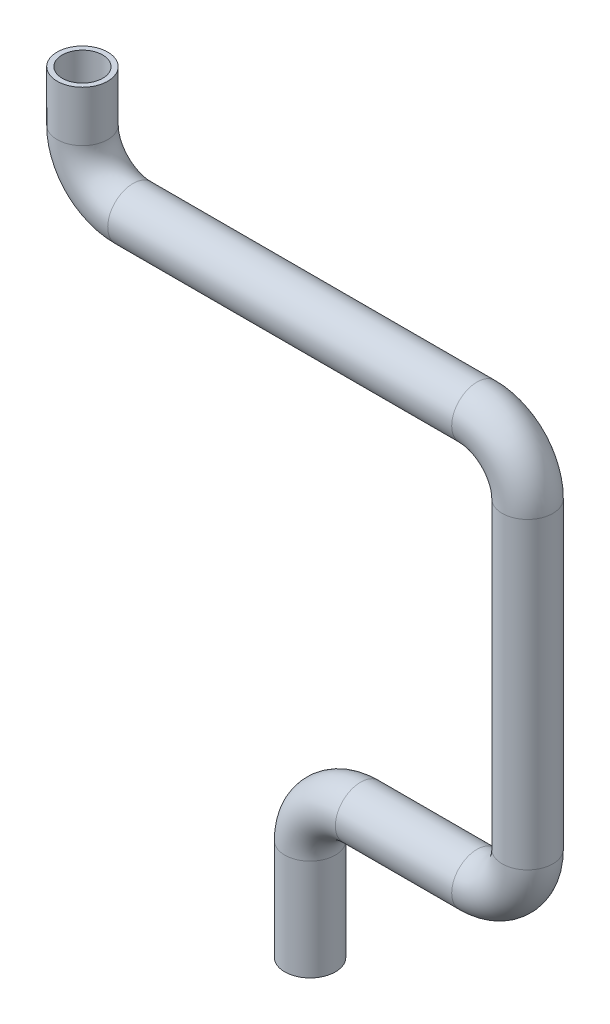
ISO-10303-21;
HEADER;
FILE_DESCRIPTION(('STEP AP214'),'2;1');
FILE_NAME('part.step','',(''),(''),'','','');
FILE_SCHEMA(('AUTOMOTIVE_DESIGN { 1 0 10303 214 1 1 1 1 }'));
ENDSEC;
DATA;
#1=APPLICATION_CONTEXT('core data for automotive mechanical design processes');
#2=APPLICATION_PROTOCOL_DEFINITION('international standard','automotive_design',2000,#1);
#3=PRODUCT_CONTEXT('',#1,'mechanical');
#4=PRODUCT('Part','Part','',(#3));
#5=PRODUCT_RELATED_PRODUCT_CATEGORY('part','',(#4));
#6=PRODUCT_DEFINITION_FORMATION('','',#4);
#7=PRODUCT_DEFINITION_CONTEXT('part definition',#1,'design');
#8=PRODUCT_DEFINITION('design','',#6,#7);
#9=PRODUCT_DEFINITION_SHAPE('','',#8);
#10=(LENGTH_UNIT() NAMED_UNIT(*) SI_UNIT(.MILLI.,.METRE.));
#11=(NAMED_UNIT(*) PLANE_ANGLE_UNIT() SI_UNIT($,.RADIAN.));
#12=(NAMED_UNIT(*) SI_UNIT($,.STERADIAN.) SOLID_ANGLE_UNIT());
#13=UNCERTAINTY_MEASURE_WITH_UNIT(LENGTH_MEASURE(1.E-05),#10,'distance_accuracy_value','');
#14=(GEOMETRIC_REPRESENTATION_CONTEXT(3) GLOBAL_UNCERTAINTY_ASSIGNED_CONTEXT((#13)) GLOBAL_UNIT_ASSIGNED_CONTEXT((#10,
#11,#12)) REPRESENTATION_CONTEXT('',''));
#15=CARTESIAN_POINT('',(0.,0.,0.));
#16=DIRECTION('',(0.,0.,1.));
#17=DIRECTION('',(1.,0.,0.));
#18=AXIS2_PLACEMENT_3D('',#15,#16,#17);
#19=CARTESIAN_POINT('',(0.,0.,0.));
#20=DIRECTION('',(0.,-1.,0.));
#21=DIRECTION('',(0.,0.,-1.));
#22=AXIS2_PLACEMENT_3D('',#19,#20,#21);
#23=PLANE('',#22);
#24=CARTESIAN_POINT('',(0.,0.,0.));
#25=DIRECTION('',(0.,-1.,0.));
#26=DIRECTION('',(0.,0.,-1.));
#27=AXIS2_PLACEMENT_3D('',#24,#25,#26);
#28=CIRCLE('',#27,4.);
#29=CARTESIAN_POINT('',(0.,0.,-4.));
#30=VERTEX_POINT('',#29);
#31=EDGE_CURVE('E103',#30,#30,#28,.T.);
#32=ORIENTED_EDGE('',*,*,#31,.F.);
#33=EDGE_LOOP('',(#32));
#34=FACE_BOUND('',#33,.T.);
#35=CARTESIAN_POINT('',(0.,0.,0.));
#36=DIRECTION('',(0.,-1.,0.));
#37=DIRECTION('',(0.,0.,-1.));
#38=AXIS2_PLACEMENT_3D('',#35,#36,#37);
#39=CIRCLE('',#38,5.);
#40=CARTESIAN_POINT('',(0.,0.,-5.));
#41=VERTEX_POINT('',#40);
#42=EDGE_CURVE('E100',#41,#41,#39,.T.);
#43=ORIENTED_EDGE('',*,*,#42,.T.);
#44=EDGE_LOOP('',(#43));
#45=FACE_BOUND('',#44,.T.);
#46=ADVANCED_FACE('F66',(#34,#45),#23,.T.);
#47=CARTESIAN_POINT('',(-45.,130.,0.));
#48=DIRECTION('',(0.,-1.,0.));
#49=DIRECTION('',(0.,0.,-1.));
#50=AXIS2_PLACEMENT_3D('',#47,#48,#49);
#51=PLANE('',#50);
#52=CARTESIAN_POINT('',(-44.9999999999999,130.,0.));
#53=DIRECTION('',(0.,-1.,0.));
#54=DIRECTION('',(0.,0.,-1.));
#55=AXIS2_PLACEMENT_3D('',#52,#53,#54);
#56=CIRCLE('',#55,4.);
#57=CARTESIAN_POINT('',(-44.9999999999999,130.,-4.));
#58=VERTEX_POINT('',#57);
#59=EDGE_CURVE('E106',#58,#58,#56,.T.);
#60=ORIENTED_EDGE('',*,*,#59,.T.);
#61=EDGE_LOOP('',(#60));
#62=FACE_BOUND('',#61,.T.);
#63=CARTESIAN_POINT('',(-45.,130.,0.));
#64=DIRECTION('',(0.,-1.,0.));
#65=DIRECTION('',(0.,0.,-1.));
#66=AXIS2_PLACEMENT_3D('',#63,#64,#65);
#67=CIRCLE('',#66,5.);
#68=CARTESIAN_POINT('',(-45.,130.,-5.));
#69=VERTEX_POINT('',#68);
#70=EDGE_CURVE('E11',#69,#69,#67,.T.);
#71=ORIENTED_EDGE('',*,*,#70,.F.);
#72=EDGE_LOOP('',(#71));
#73=FACE_BOUND('',#72,.T.);
#74=ADVANCED_FACE('F134',(#62,#73),#51,.F.);
#75=CARTESIAN_POINT('',(0.,0.,0.));
#76=DIRECTION('',(0.,1.,0.));
#77=DIRECTION('',(0.,0.,1.));
#78=AXIS2_PLACEMENT_3D('',#75,#76,#77);
#79=CYLINDRICAL_SURFACE('',#78,5.);
#80=CARTESIAN_POINT('',(0.,20.,0.));
#81=DIRECTION('',(0.,-1.,0.));
#82=DIRECTION('',(0.,0.,-1.));
#83=AXIS2_PLACEMENT_3D('',#80,#81,#82);
#84=CIRCLE('',#83,5.);
#85=CARTESIAN_POINT('',(-5.00000000000007,20.,0.));
#86=VERTEX_POINT('',#85);
#87=EDGE_CURVE('E97',#86,#86,#84,.T.);
#88=ORIENTED_EDGE('',*,*,#87,.T.);
#89=EDGE_LOOP('',(#88));
#90=FACE_BOUND('',#89,.T.);
#91=ORIENTED_EDGE('',*,*,#42,.F.);
#92=EDGE_LOOP('',(#91));
#93=FACE_BOUND('',#92,.T.);
#94=ADVANCED_FACE('F196',(#90,#93),#79,.T.);
#95=CARTESIAN_POINT('',(9.99999999999986,20.,0.));
#96=DIRECTION('',(0.,0.,-1.));
#97=DIRECTION('',(-1.,0.,0.));
#98=AXIS2_PLACEMENT_3D('',#95,#96,#97);
#99=TOROIDAL_SURFACE('',#98,9.99999999999993,5.);
#100=CARTESIAN_POINT('',(9.99999999999979,29.9999999999999,0.));
#101=DIRECTION('',(-1.,0.,0.));
#102=DIRECTION('',(0.,0.,-1.));
#103=AXIS2_PLACEMENT_3D('',#100,#101,#102);
#104=CIRCLE('',#103,5.);
#105=CARTESIAN_POINT('',(9.99999999999975,34.9999999999999,0.));
#106=VERTEX_POINT('',#105);
#107=EDGE_CURVE('E94',#106,#106,#104,.T.);
#108=CARTESIAN_POINT('',(9.99999999999986,20.,0.));
#109=DIRECTION('',(0.,0.,-1.));
#110=DIRECTION('',(-1.,0.,0.));
#111=AXIS2_PLACEMENT_3D('',#108,#109,#110);
#112=CIRCLE('',#111,14.9999999999999);
#113=EDGE_CURVE('',#86,#106,#112,.T.);
#114=ORIENTED_EDGE('',*,*,#87,.F.);
#115=ORIENTED_EDGE('',*,*,#107,.T.);
#116=ORIENTED_EDGE('',*,*,#113,.T.);
#117=ORIENTED_EDGE('',*,*,#113,.F.);
#118=EDGE_LOOP('',(#114,#116,#115,#117));
#119=FACE_BOUND('',#118,.T.);
#120=ADVANCED_FACE('F198',(#119),#99,.T.);
#121=CARTESIAN_POINT('',(9.99999999999979,30.,0.));
#122=DIRECTION('',(1.,0.,0.));
#123=DIRECTION('',(0.,1.,0.));
#124=AXIS2_PLACEMENT_3D('',#121,#122,#123);
#125=CYLINDRICAL_SURFACE('',#124,5.);
#126=CARTESIAN_POINT('',(32.9999999999998,30.0000000000004,0.));
#127=DIRECTION('',(-1.,0.,0.));
#128=DIRECTION('',(0.,0.,-1.));
#129=AXIS2_PLACEMENT_3D('',#126,#127,#128);
#130=CIRCLE('',#129,5.);
#131=CARTESIAN_POINT('',(32.9999999999998,25.0000000000004,0.));
#132=VERTEX_POINT('',#131);
#133=EDGE_CURVE('E91',#132,#132,#130,.T.);
#134=ORIENTED_EDGE('',*,*,#133,.T.);
#135=EDGE_LOOP('',(#134));
#136=FACE_BOUND('',#135,.T.);
#137=ORIENTED_EDGE('',*,*,#107,.F.);
#138=EDGE_LOOP('',(#137));
#139=FACE_BOUND('',#138,.T.);
#140=ADVANCED_FACE('F205',(#136,#139),#125,.T.);
#141=CARTESIAN_POINT('',(32.9999999999997,40.0000000000004,0.));
#142=DIRECTION('',(0.,0.,1.));
#143=DIRECTION('',(1.,0.,0.));
#144=AXIS2_PLACEMENT_3D('',#141,#142,#143);
#145=TOROIDAL_SURFACE('',#144,9.99999999999999,5.);
#146=CARTESIAN_POINT('',(42.9999999999997,40.0000000000004,0.));
#147=DIRECTION('',(0.,-1.,0.));
#148=DIRECTION('',(0.,0.,-1.));
#149=AXIS2_PLACEMENT_3D('',#146,#147,#148);
#150=CIRCLE('',#149,5.);
#151=CARTESIAN_POINT('',(47.9999999999997,40.0000000000004,0.));
#152=VERTEX_POINT('',#151);
#153=EDGE_CURVE('E88',#152,#152,#150,.T.);
#154=CARTESIAN_POINT('',(32.9999999999997,40.0000000000004,0.));
#155=DIRECTION('',(0.,0.,1.));
#156=DIRECTION('',(1.,0.,0.));
#157=AXIS2_PLACEMENT_3D('',#154,#155,#156);
#158=CIRCLE('',#157,15.);
#159=EDGE_CURVE('',#132,#152,#158,.T.);
#160=ORIENTED_EDGE('',*,*,#133,.F.);
#161=ORIENTED_EDGE('',*,*,#153,.T.);
#162=ORIENTED_EDGE('',*,*,#159,.T.);
#163=ORIENTED_EDGE('',*,*,#159,.F.);
#164=EDGE_LOOP('',(#160,#162,#161,#163));
#165=FACE_BOUND('',#164,.T.);
#166=ADVANCED_FACE('F228',(#165),#145,.T.);
#167=CARTESIAN_POINT('',(42.9999999999992,40.0000000000003,0.));
#168=DIRECTION('',(0.,1.,0.));
#169=DIRECTION('',(-1.,0.,0.));
#170=AXIS2_PLACEMENT_3D('',#167,#168,#169);
#171=CYLINDRICAL_SURFACE('',#170,5.);
#172=CARTESIAN_POINT('',(42.9999999999994,99.9999999999997,0.));
#173=DIRECTION('',(0.,-1.,0.));
#174=DIRECTION('',(0.,0.,-1.));
#175=AXIS2_PLACEMENT_3D('',#172,#173,#174);
#176=CIRCLE('',#175,5.);
#177=CARTESIAN_POINT('',(47.9999999999985,99.9999999999996,0.));
#178=VERTEX_POINT('',#177);
#179=EDGE_CURVE('E85',#178,#178,#176,.T.);
#180=ORIENTED_EDGE('',*,*,#179,.T.);
#181=EDGE_LOOP('',(#180));
#182=FACE_BOUND('',#181,.T.);
#183=ORIENTED_EDGE('',*,*,#153,.F.);
#184=EDGE_LOOP('',(#183));
#185=FACE_BOUND('',#184,.T.);
#186=ADVANCED_FACE('F224',(#182,#185),#171,.T.);
#187=CARTESIAN_POINT('',(32.9999999999999,100.,0.));
#188=DIRECTION('',(0.,0.,1.));
#189=DIRECTION('',(1.,0.,0.));
#190=AXIS2_PLACEMENT_3D('',#187,#188,#189);
#191=TOROIDAL_SURFACE('',#190,9.99999999999857,5.);
#192=CARTESIAN_POINT('',(32.9999999999999,110.,0.));
#193=DIRECTION('',(1.,0.,0.));
#194=DIRECTION('',(0.,0.,-1.));
#195=AXIS2_PLACEMENT_3D('',#192,#193,#194);
#196=CIRCLE('',#195,5.);
#197=CARTESIAN_POINT('',(32.9999999999999,114.999999999999,0.));
#198=VERTEX_POINT('',#197);
#199=EDGE_CURVE('E80',#198,#198,#196,.T.);
#200=CARTESIAN_POINT('',(32.9999999999999,100.,0.));
#201=DIRECTION('',(0.,0.,1.));
#202=DIRECTION('',(1.,0.,0.));
#203=AXIS2_PLACEMENT_3D('',#200,#201,#202);
#204=CIRCLE('',#203,14.9999999999986);
#205=EDGE_CURVE('',#178,#198,#204,.T.);
#206=ORIENTED_EDGE('',*,*,#179,.F.);
#207=ORIENTED_EDGE('',*,*,#199,.T.);
#208=ORIENTED_EDGE('',*,*,#205,.T.);
#209=ORIENTED_EDGE('',*,*,#205,.F.);
#210=EDGE_LOOP('',(#206,#208,#207,#209));
#211=FACE_BOUND('',#210,.T.);
#212=ADVANCED_FACE('F220',(#211),#191,.T.);
#213=CARTESIAN_POINT('',(32.9999999999999,110.,0.));
#214=DIRECTION('',(-1.,0.,0.));
#215=DIRECTION('',(0.,-1.,0.));
#216=AXIS2_PLACEMENT_3D('',#213,#214,#215);
#217=CYLINDRICAL_SURFACE('',#216,5.);
#218=CARTESIAN_POINT('',(-34.9999999999999,110.,0.));
#219=DIRECTION('',(1.,0.,0.));
#220=DIRECTION('',(0.,0.,-1.));
#221=AXIS2_PLACEMENT_3D('',#218,#219,#220);
#222=CIRCLE('',#221,5.);
#223=CARTESIAN_POINT('',(-34.9999999999999,105.,0.));
#224=VERTEX_POINT('',#223);
#225=EDGE_CURVE('E76',#224,#224,#222,.T.);
#226=ORIENTED_EDGE('',*,*,#225,.T.);
#227=EDGE_LOOP('',(#226));
#228=FACE_BOUND('',#227,.T.);
#229=ORIENTED_EDGE('',*,*,#199,.F.);
#230=EDGE_LOOP('',(#229));
#231=FACE_BOUND('',#230,.T.);
#232=ADVANCED_FACE('F214',(#228,#231),#217,.T.);
#233=CARTESIAN_POINT('',(-35.,120.,0.));
#234=DIRECTION('',(0.,0.,-1.));
#235=DIRECTION('',(-1.,0.,0.));
#236=AXIS2_PLACEMENT_3D('',#233,#234,#235);
#237=TOROIDAL_SURFACE('',#236,9.99999999999999,5.);
#238=CARTESIAN_POINT('',(-45.,120.,0.));
#239=DIRECTION('',(0.,-1.,0.));
#240=DIRECTION('',(0.,0.,-1.));
#241=AXIS2_PLACEMENT_3D('',#238,#239,#240);
#242=CIRCLE('',#241,5.);
#243=CARTESIAN_POINT('',(-50.,120.,0.));
#244=VERTEX_POINT('',#243);
#245=EDGE_CURVE('E72',#244,#244,#242,.T.);
#246=CARTESIAN_POINT('',(-35.,120.,0.));
#247=DIRECTION('',(0.,0.,-1.));
#248=DIRECTION('',(-1.,0.,0.));
#249=AXIS2_PLACEMENT_3D('',#246,#247,#248);
#250=CIRCLE('',#249,15.);
#251=EDGE_CURVE('',#224,#244,#250,.T.);
#252=ORIENTED_EDGE('',*,*,#225,.F.);
#253=ORIENTED_EDGE('',*,*,#245,.T.);
#254=ORIENTED_EDGE('',*,*,#251,.T.);
#255=ORIENTED_EDGE('',*,*,#251,.F.);
#256=EDGE_LOOP('',(#252,#254,#253,#255));
#257=FACE_BOUND('',#256,.T.);
#258=ADVANCED_FACE('F209',(#257),#237,.T.);
#259=CARTESIAN_POINT('',(-45.,120.,0.));
#260=DIRECTION('',(0.,1.,0.));
#261=DIRECTION('',(0.,0.,1.));
#262=AXIS2_PLACEMENT_3D('',#259,#260,#261);
#263=CYLINDRICAL_SURFACE('',#262,5.);
#264=ORIENTED_EDGE('',*,*,#70,.T.);
#265=EDGE_LOOP('',(#264));
#266=FACE_BOUND('',#265,.T.);
#267=ORIENTED_EDGE('',*,*,#245,.F.);
#268=EDGE_LOOP('',(#267));
#269=FACE_BOUND('',#268,.T.);
#270=ADVANCED_FACE('F188',(#266,#269),#263,.T.);
#271=CARTESIAN_POINT('',(0.,-1.,0.));
#272=DIRECTION('',(0.,1.,0.));
#273=DIRECTION('',(-1.,0.,0.));
#274=AXIS2_PLACEMENT_3D('',#271,#272,#273);
#275=CYLINDRICAL_SURFACE('',#274,4.);
#276=CARTESIAN_POINT('',(0.,20.,0.));
#277=DIRECTION('',(0.,-1.,0.));
#278=DIRECTION('',(0.,0.,-1.));
#279=AXIS2_PLACEMENT_3D('',#276,#277,#278);
#280=CIRCLE('',#279,4.);
#281=CARTESIAN_POINT('',(-4.,20.,0.));
#282=VERTEX_POINT('',#281);
#283=EDGE_CURVE('E107',#282,#282,#280,.T.);
#284=ORIENTED_EDGE('',*,*,#283,.F.);
#285=EDGE_LOOP('',(#284));
#286=FACE_BOUND('',#285,.T.);
#287=ORIENTED_EDGE('',*,*,#31,.T.);
#288=EDGE_LOOP('',(#287));
#289=FACE_BOUND('',#288,.T.);
#290=ADVANCED_FACE('F142',(#286,#289),#275,.F.);
#291=CARTESIAN_POINT('',(10.,20.,0.));
#292=DIRECTION('',(0.,0.,-1.));
#293=DIRECTION('',(-1.,0.,0.));
#294=AXIS2_PLACEMENT_3D('',#291,#292,#293);
#295=TOROIDAL_SURFACE('',#294,10.,4.);
#296=CARTESIAN_POINT('',(9.99999999999999,30.,0.));
#297=DIRECTION('',(-1.,0.,0.));
#298=DIRECTION('',(0.,0.,-1.));
#299=AXIS2_PLACEMENT_3D('',#296,#297,#298);
#300=CIRCLE('',#299,4.);
#301=CARTESIAN_POINT('',(9.99999999999999,34.,0.));
#302=VERTEX_POINT('',#301);
#303=EDGE_CURVE('E110',#302,#302,#300,.T.);
#304=CARTESIAN_POINT('',(10.,20.,0.));
#305=DIRECTION('',(0.,0.,-1.));
#306=DIRECTION('',(-1.,0.,0.));
#307=AXIS2_PLACEMENT_3D('',#304,#305,#306);
#308=CIRCLE('',#307,14.);
#309=EDGE_CURVE('',#282,#302,#308,.T.);
#310=ORIENTED_EDGE('',*,*,#283,.T.);
#311=ORIENTED_EDGE('',*,*,#303,.F.);
#312=ORIENTED_EDGE('',*,*,#309,.T.);
#313=ORIENTED_EDGE('',*,*,#309,.F.);
#314=EDGE_LOOP('',(#310,#312,#311,#313));
#315=FACE_BOUND('',#314,.T.);
#316=ADVANCED_FACE('F177',(#315),#295,.F.);
#317=CARTESIAN_POINT('',(9.99999999999999,30.,0.));
#318=DIRECTION('',(1.,0.,0.));
#319=DIRECTION('',(0.,1.,0.));
#320=AXIS2_PLACEMENT_3D('',#317,#318,#319);
#321=CYLINDRICAL_SURFACE('',#320,4.);
#322=CARTESIAN_POINT('',(33.,30.,0.));
#323=DIRECTION('',(-1.,0.,0.));
#324=DIRECTION('',(0.,0.,-1.));
#325=AXIS2_PLACEMENT_3D('',#322,#323,#324);
#326=CIRCLE('',#325,4.);
#327=CARTESIAN_POINT('',(33.,26.,0.));
#328=VERTEX_POINT('',#327);
#329=EDGE_CURVE('E113',#328,#328,#326,.T.);
#330=ORIENTED_EDGE('',*,*,#329,.F.);
#331=EDGE_LOOP('',(#330));
#332=FACE_BOUND('',#331,.T.);
#333=ORIENTED_EDGE('',*,*,#303,.T.);
#334=EDGE_LOOP('',(#333));
#335=FACE_BOUND('',#334,.T.);
#336=ADVANCED_FACE('F171',(#332,#335),#321,.F.);
#337=CARTESIAN_POINT('',(33.,40.,0.));
#338=DIRECTION('',(0.,0.,1.));
#339=DIRECTION('',(1.,0.,0.));
#340=AXIS2_PLACEMENT_3D('',#337,#338,#339);
#341=TOROIDAL_SURFACE('',#340,9.99999999999998,4.);
#342=CARTESIAN_POINT('',(43.0000000000001,40.0000000000001,0.));
#343=DIRECTION('',(0.,-1.,0.));
#344=DIRECTION('',(0.,0.,-1.));
#345=AXIS2_PLACEMENT_3D('',#342,#343,#344);
#346=CIRCLE('',#345,4.);
#347=CARTESIAN_POINT('',(47.,40.0000000000001,0.));
#348=VERTEX_POINT('',#347);
#349=EDGE_CURVE('E116',#348,#348,#346,.T.);
#350=CARTESIAN_POINT('',(33.,40.,0.));
#351=DIRECTION('',(0.,0.,1.));
#352=DIRECTION('',(1.,0.,0.));
#353=AXIS2_PLACEMENT_3D('',#350,#351,#352);
#354=CIRCLE('',#353,14.);
#355=EDGE_CURVE('',#328,#348,#354,.T.);
#356=ORIENTED_EDGE('',*,*,#329,.T.);
#357=ORIENTED_EDGE('',*,*,#349,.F.);
#358=ORIENTED_EDGE('',*,*,#355,.T.);
#359=ORIENTED_EDGE('',*,*,#355,.F.);
#360=EDGE_LOOP('',(#356,#358,#357,#359));
#361=FACE_BOUND('',#360,.T.);
#362=ADVANCED_FACE('F165',(#361),#341,.F.);
#363=CARTESIAN_POINT('',(43.,40.,0.));
#364=DIRECTION('',(0.,1.,0.));
#365=DIRECTION('',(-1.,0.,0.));
#366=AXIS2_PLACEMENT_3D('',#363,#364,#365);
#367=CYLINDRICAL_SURFACE('',#366,4.);
#368=CARTESIAN_POINT('',(43.,99.9999999999999,0.));
#369=DIRECTION('',(0.,-1.,0.));
#370=DIRECTION('',(0.,0.,-1.));
#371=AXIS2_PLACEMENT_3D('',#368,#369,#370);
#372=CIRCLE('',#371,4.);
#373=CARTESIAN_POINT('',(46.9999999999985,99.9999999999999,0.));
#374=VERTEX_POINT('',#373);
#375=EDGE_CURVE('E119',#374,#374,#372,.T.);
#376=ORIENTED_EDGE('',*,*,#375,.F.);
#377=EDGE_LOOP('',(#376));
#378=FACE_BOUND('',#377,.T.);
#379=ORIENTED_EDGE('',*,*,#349,.T.);
#380=EDGE_LOOP('',(#379));
#381=FACE_BOUND('',#380,.T.);
#382=ADVANCED_FACE('F159',(#378,#381),#367,.F.);
#383=CARTESIAN_POINT('',(32.9999999999999,100.,0.));
#384=DIRECTION('',(0.,0.,1.));
#385=DIRECTION('',(1.,0.,0.));
#386=AXIS2_PLACEMENT_3D('',#383,#384,#385);
#387=TOROIDAL_SURFACE('',#386,9.99999999999856,4.);
#388=CARTESIAN_POINT('',(32.9999999999999,110.,0.));
#389=DIRECTION('',(1.,0.,0.));
#390=DIRECTION('',(0.,0.,-1.));
#391=AXIS2_PLACEMENT_3D('',#388,#389,#390);
#392=CIRCLE('',#391,4.);
#393=CARTESIAN_POINT('',(32.9999999999999,113.999999999999,0.));
#394=VERTEX_POINT('',#393);
#395=EDGE_CURVE('E122',#394,#394,#392,.T.);
#396=CARTESIAN_POINT('',(32.9999999999999,100.,0.));
#397=DIRECTION('',(0.,0.,1.));
#398=DIRECTION('',(1.,0.,0.));
#399=AXIS2_PLACEMENT_3D('',#396,#397,#398);
#400=CIRCLE('',#399,13.9999999999986);
#401=EDGE_CURVE('',#374,#394,#400,.T.);
#402=ORIENTED_EDGE('',*,*,#375,.T.);
#403=ORIENTED_EDGE('',*,*,#395,.F.);
#404=ORIENTED_EDGE('',*,*,#401,.T.);
#405=ORIENTED_EDGE('',*,*,#401,.F.);
#406=EDGE_LOOP('',(#402,#404,#403,#405));
#407=FACE_BOUND('',#406,.T.);
#408=ADVANCED_FACE('F153',(#407),#387,.F.);
#409=CARTESIAN_POINT('',(32.9999999999999,110.,0.));
#410=DIRECTION('',(-1.,0.,0.));
#411=DIRECTION('',(0.,-1.,0.));
#412=AXIS2_PLACEMENT_3D('',#409,#410,#411);
#413=CYLINDRICAL_SURFACE('',#412,4.);
#414=CARTESIAN_POINT('',(-34.9999999999999,110.,0.));
#415=DIRECTION('',(1.,0.,0.));
#416=DIRECTION('',(0.,0.,-1.));
#417=AXIS2_PLACEMENT_3D('',#414,#415,#416);
#418=CIRCLE('',#417,4.);
#419=CARTESIAN_POINT('',(-34.9999999999999,106.,0.));
#420=VERTEX_POINT('',#419);
#421=EDGE_CURVE('E125',#420,#420,#418,.T.);
#422=ORIENTED_EDGE('',*,*,#421,.F.);
#423=EDGE_LOOP('',(#422));
#424=FACE_BOUND('',#423,.T.);
#425=ORIENTED_EDGE('',*,*,#395,.T.);
#426=EDGE_LOOP('',(#425));
#427=FACE_BOUND('',#426,.T.);
#428=ADVANCED_FACE('F147',(#424,#427),#413,.F.);
#429=CARTESIAN_POINT('',(-34.9999999999999,120.,0.));
#430=DIRECTION('',(0.,0.,-1.));
#431=DIRECTION('',(-1.,0.,0.));
#432=AXIS2_PLACEMENT_3D('',#429,#430,#431);
#433=TOROIDAL_SURFACE('',#432,9.99999999999998,4.);
#434=CARTESIAN_POINT('',(-44.9999999999999,120.,0.));
#435=DIRECTION('',(0.,-1.,0.));
#436=DIRECTION('',(0.,0.,-1.));
#437=AXIS2_PLACEMENT_3D('',#434,#435,#436);
#438=CIRCLE('',#437,4.);
#439=CARTESIAN_POINT('',(-48.9999999999999,120.,0.));
#440=VERTEX_POINT('',#439);
#441=EDGE_CURVE('E128',#440,#440,#438,.T.);
#442=CARTESIAN_POINT('',(-34.9999999999999,120.,0.));
#443=DIRECTION('',(0.,0.,-1.));
#444=DIRECTION('',(-1.,0.,0.));
#445=AXIS2_PLACEMENT_3D('',#442,#443,#444);
#446=CIRCLE('',#445,14.);
#447=EDGE_CURVE('',#420,#440,#446,.T.);
#448=ORIENTED_EDGE('',*,*,#421,.T.);
#449=ORIENTED_EDGE('',*,*,#441,.F.);
#450=ORIENTED_EDGE('',*,*,#447,.T.);
#451=ORIENTED_EDGE('',*,*,#447,.F.);
#452=EDGE_LOOP('',(#448,#450,#449,#451));
#453=FACE_BOUND('',#452,.T.);
#454=ADVANCED_FACE('F140',(#453),#433,.F.);
#455=CARTESIAN_POINT('',(-44.9999999999999,120.,0.));
#456=DIRECTION('',(0.,1.,0.));
#457=DIRECTION('',(0.,0.,1.));
#458=AXIS2_PLACEMENT_3D('',#455,#456,#457);
#459=CYLINDRICAL_SURFACE('',#458,4.);
#460=ORIENTED_EDGE('',*,*,#59,.F.);
#461=EDGE_LOOP('',(#460));
#462=FACE_BOUND('',#461,.T.);
#463=ORIENTED_EDGE('',*,*,#441,.T.);
#464=EDGE_LOOP('',(#463));
#465=FACE_BOUND('',#464,.T.);
#466=ADVANCED_FACE('F137',(#462,#465),#459,.F.);
#467=CLOSED_SHELL('',(#46,#74,#94,#120,#140,#166,#186,#212,#232,#258,#270,#290,#316,#336,#362,
#382,#408,#428,#454,#466));
#468=MANIFOLD_SOLID_BREP('B2',#467);
#469=ADVANCED_BREP_SHAPE_REPRESENTATION('',(#18,#468),#14);
#470=SHAPE_DEFINITION_REPRESENTATION(#9,#469);
ENDSEC;
END-ISO-10303-21;
